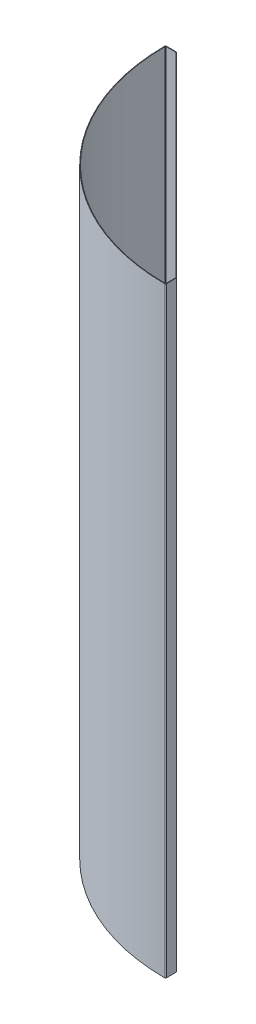
ISO-10303-21;
HEADER;
FILE_DESCRIPTION(('STEP AP214'),'2;1');
FILE_NAME('part.step','',(''),(''),'','','');
FILE_SCHEMA(('AUTOMOTIVE_DESIGN { 1 0 10303 214 1 1 1 1 }'));
ENDSEC;
DATA;
#1=APPLICATION_CONTEXT('core data for automotive mechanical design processes');
#2=APPLICATION_PROTOCOL_DEFINITION('international standard','automotive_design',2000,#1);
#3=PRODUCT_CONTEXT('',#1,'mechanical');
#4=PRODUCT('Part','Part','',(#3));
#5=PRODUCT_RELATED_PRODUCT_CATEGORY('part','',(#4));
#6=PRODUCT_DEFINITION_FORMATION('','',#4);
#7=PRODUCT_DEFINITION_CONTEXT('part definition',#1,'design');
#8=PRODUCT_DEFINITION('design','',#6,#7);
#9=PRODUCT_DEFINITION_SHAPE('','',#8);
#10=(LENGTH_UNIT() NAMED_UNIT(*) SI_UNIT(.MILLI.,.METRE.));
#11=(NAMED_UNIT(*) PLANE_ANGLE_UNIT() SI_UNIT($,.RADIAN.));
#12=(NAMED_UNIT(*) SI_UNIT($,.STERADIAN.) SOLID_ANGLE_UNIT());
#13=UNCERTAINTY_MEASURE_WITH_UNIT(LENGTH_MEASURE(1.E-05),#10,'distance_accuracy_value','');
#14=(GEOMETRIC_REPRESENTATION_CONTEXT(3) GLOBAL_UNCERTAINTY_ASSIGNED_CONTEXT((#13)) GLOBAL_UNIT_ASSIGNED_CONTEXT((#10,
#11,#12)) REPRESENTATION_CONTEXT('',''));
#15=CARTESIAN_POINT('',(0.,0.,0.));
#16=DIRECTION('',(0.,0.,1.));
#17=DIRECTION('',(1.,0.,0.));
#18=AXIS2_PLACEMENT_3D('',#15,#16,#17);
#19=CARTESIAN_POINT('',(-92.4999999999991,-731.,92.4999999999996));
#20=DIRECTION('',(0.,1.,0.));
#21=DIRECTION('',(-0.999997106121887,0.,-0.00240577385725729));
#22=AXIS2_PLACEMENT_3D('',#19,#20,#21);
#23=PLANE('',#22);
#24=DIRECTION('',(-0.00240577385725768,0.,0.999997106121887));
#25=VECTOR('',#24,1.);
#26=CARTESIAN_POINT('',(-93.7028869286286,-731.,592.498553060943));
#27=LINE('',#26,#25);
#28=CARTESIAN_POINT('',(-93.7028869286286,-731.,592.498553060943));
#29=VERTEX_POINT('',#28);
#30=CARTESIAN_POINT('',(-93.7057738572573,-731.,593.69854958829));
#31=VERTEX_POINT('',#30);
#32=EDGE_CURVE('E237',#29,#31,#27,.T.);
#33=ORIENTED_EDGE('',*,*,#32,.T.);
#34=CARTESIAN_POINT('',(-92.4999999999991,-731.,92.4999999999996));
#35=DIRECTION('',(0.,1.,0.));
#36=DIRECTION('',(-0.999997106121887,0.,-0.00240577385725729));
#37=AXIS2_PLACEMENT_3D('',#34,#35,#36);
#38=CIRCLE('',#37,501.200000000001);
#39=CARTESIAN_POINT('',(-593.69854958829,-731.,93.7057738572566));
#40=VERTEX_POINT('',#39);
#41=EDGE_CURVE('E56',#31,#40,#38,.F.);
#42=ORIENTED_EDGE('',*,*,#41,.T.);
#43=DIRECTION('',(0.999997106121887,0.,-0.00240577385724612));
#44=VECTOR('',#43,1.);
#45=CARTESIAN_POINT('',(-593.69854958829,-731.,93.7057738572583));
#46=LINE('',#45,#44);
#47=CARTESIAN_POINT('',(-592.498553060944,-731.,93.7028869286292));
#48=VERTEX_POINT('',#47);
#49=EDGE_CURVE('E242',#40,#48,#46,.T.);
#50=ORIENTED_EDGE('',*,*,#49,.T.);
#51=CARTESIAN_POINT('',(-92.4999999999991,-731.,92.4999999999996));
#52=DIRECTION('',(0.,-1.,0.));
#53=DIRECTION('',(0.999997106121887,0.,0.00240577385725729));
#54=AXIS2_PLACEMENT_3D('',#51,#52,#53);
#55=CIRCLE('',#54,500.000000000001);
#56=EDGE_CURVE('E221',#29,#48,#55,.T.);
#57=ORIENTED_EDGE('',*,*,#56,.F.);
#58=EDGE_LOOP('',(#33,#42,#50,#57));
#59=FACE_BOUND('',#58,.T.);
#60=ADVANCED_FACE('F36',(#59),#23,.F.);
#61=CARTESIAN_POINT('',(-92.4999999999991,731.,92.4999999999996));
#62=DIRECTION('',(0.,-1.,0.));
#63=DIRECTION('',(0.999997106121887,0.,0.00240577385725729));
#64=AXIS2_PLACEMENT_3D('',#61,#62,#63);
#65=PLANE('',#64);
#66=DIRECTION('',(-0.999997106121887,0.,0.00240577385724612));
#67=VECTOR('',#66,1.);
#68=CARTESIAN_POINT('',(-592.498553060944,731.,93.7028869286296));
#69=LINE('',#68,#67);
#70=CARTESIAN_POINT('',(-592.498553060944,731.,93.7028869286284));
#71=VERTEX_POINT('',#70);
#72=CARTESIAN_POINT('',(-593.69854958829,731.,93.7057738572583));
#73=VERTEX_POINT('',#72);
#74=EDGE_CURVE('E11',#71,#73,#69,.T.);
#75=ORIENTED_EDGE('',*,*,#74,.T.);
#76=CARTESIAN_POINT('',(-92.4999999999991,731.,92.4999999999996));
#77=DIRECTION('',(0.,1.,0.));
#78=DIRECTION('',(-0.999997106121887,0.,-0.00240577385725729));
#79=AXIS2_PLACEMENT_3D('',#76,#77,#78);
#80=CIRCLE('',#79,501.200000000001);
#81=CARTESIAN_POINT('',(-93.7057738572573,731.,593.69854958829));
#82=VERTEX_POINT('',#81);
#83=EDGE_CURVE('E225',#73,#82,#80,.T.);
#84=ORIENTED_EDGE('',*,*,#83,.T.);
#85=DIRECTION('',(0.00240577385725768,0.,-0.999997106121887));
#86=VECTOR('',#85,1.);
#87=CARTESIAN_POINT('',(-93.7057738572573,731.,593.69854958829));
#88=LINE('',#87,#86);
#89=CARTESIAN_POINT('',(-93.7028869286286,731.,592.498553060943));
#90=VERTEX_POINT('',#89);
#91=EDGE_CURVE('E233',#82,#90,#88,.T.);
#92=ORIENTED_EDGE('',*,*,#91,.T.);
#93=CARTESIAN_POINT('',(-92.4999999999991,731.,92.4999999999996));
#94=DIRECTION('',(0.,1.,0.));
#95=DIRECTION('',(-0.999997106121887,0.,-0.00240577385725729));
#96=AXIS2_PLACEMENT_3D('',#93,#94,#95);
#97=CIRCLE('',#96,500.000000000001);
#98=EDGE_CURVE('E224',#71,#90,#97,.T.);
#99=ORIENTED_EDGE('',*,*,#98,.F.);
#100=EDGE_LOOP('',(#75,#84,#92,#99));
#101=FACE_BOUND('',#100,.T.);
#102=ADVANCED_FACE('F294',(#101),#65,.F.);
#103=CARTESIAN_POINT('',(-92.4999999999991,-1658.71246490858,92.4999999999996));
#104=DIRECTION('',(0.,1.,0.));
#105=DIRECTION('',(-0.999997106121887,0.,-0.00240577385725729));
#106=AXIS2_PLACEMENT_3D('',#103,#104,#105);
#107=CYLINDRICAL_SURFACE('',#106,500.000000000001);
#108=ORIENTED_EDGE('',*,*,#98,.T.);
#109=DIRECTION('',(0.,1.,0.));
#110=VECTOR('',#109,1.);
#111=CARTESIAN_POINT('',(-93.7028869286286,-731.,592.498553060943));
#112=LINE('',#111,#110);
#113=EDGE_CURVE('E228',#29,#90,#112,.T.);
#114=ORIENTED_EDGE('',*,*,#113,.F.);
#115=ORIENTED_EDGE('',*,*,#56,.T.);
#116=DIRECTION('',(0.,1.,0.));
#117=VECTOR('',#116,1.);
#118=CARTESIAN_POINT('',(-592.498553060944,-731.,93.7028869286296));
#119=LINE('',#118,#117);
#120=EDGE_CURVE('E239',#48,#71,#119,.T.);
#121=ORIENTED_EDGE('',*,*,#120,.T.);
#122=EDGE_LOOP('',(#108,#114,#115,#121));
#123=FACE_BOUND('',#122,.T.);
#124=ADVANCED_FACE('F265',(#123),#107,.F.);
#125=CARTESIAN_POINT('',(-92.4999999999991,-1658.71246490858,92.4999999999996));
#126=DIRECTION('',(0.,1.,0.));
#127=DIRECTION('',(-0.999997106121887,0.,-0.00240577385725729));
#128=AXIS2_PLACEMENT_3D('',#125,#126,#127);
#129=CYLINDRICAL_SURFACE('',#128,501.200000000001);
#130=ORIENTED_EDGE('',*,*,#83,.F.);
#131=DIRECTION('',(0.,1.,0.));
#132=VECTOR('',#131,1.);
#133=CARTESIAN_POINT('',(-593.69854958829,-731.,93.7057738572583));
#134=LINE('',#133,#132);
#135=EDGE_CURVE('E43',#40,#73,#134,.T.);
#136=ORIENTED_EDGE('',*,*,#135,.F.);
#137=ORIENTED_EDGE('',*,*,#41,.F.);
#138=DIRECTION('',(0.,1.,0.));
#139=VECTOR('',#138,1.);
#140=CARTESIAN_POINT('',(-93.7057738572573,-731.,593.69854958829));
#141=LINE('',#140,#139);
#142=EDGE_CURVE('E235',#31,#82,#141,.T.);
#143=ORIENTED_EDGE('',*,*,#142,.T.);
#144=EDGE_LOOP('',(#130,#136,#137,#143));
#145=FACE_BOUND('',#144,.T.);
#146=ADVANCED_FACE('F289',(#145),#129,.T.);
#147=CARTESIAN_POINT('',(-92.4999999999999,-731.,567.5));
#148=DIRECTION('',(0.,0.,1.));
#149=DIRECTION('',(1.,0.,0.));
#150=AXIS2_PLACEMENT_3D('',#147,#148,#149);
#151=PLANE('',#150);
#152=DIRECTION('',(1.,0.,0.));
#153=VECTOR('',#152,1.);
#154=CARTESIAN_POINT('',(-92.4999999999999,731.,567.5));
#155=LINE('',#154,#153);
#156=CARTESIAN_POINT('',(-92.4999999999999,731.,567.5));
#157=VERTEX_POINT('',#156);
#158=CARTESIAN_POINT('',(-91.2999999999999,731.,567.5));
#159=VERTEX_POINT('',#158);
#160=EDGE_CURVE('E217',#157,#159,#155,.T.);
#161=ORIENTED_EDGE('',*,*,#160,.T.);
#162=DIRECTION('',(0.,1.,0.));
#163=VECTOR('',#162,1.);
#164=CARTESIAN_POINT('',(-91.2999999999999,-731.,567.5));
#165=LINE('',#164,#163);
#166=CARTESIAN_POINT('',(-91.2999999999999,-731.,567.5));
#167=VERTEX_POINT('',#166);
#168=EDGE_CURVE('E198',#167,#159,#165,.T.);
#169=ORIENTED_EDGE('',*,*,#168,.F.);
#170=DIRECTION('',(1.,0.,0.));
#171=VECTOR('',#170,1.);
#172=CARTESIAN_POINT('',(-92.4999999999999,-731.,567.5));
#173=LINE('',#172,#171);
#174=CARTESIAN_POINT('',(-92.4999999999999,-731.,567.5));
#175=VERTEX_POINT('',#174);
#176=EDGE_CURVE('E191',#175,#167,#173,.T.);
#177=ORIENTED_EDGE('',*,*,#176,.F.);
#178=DIRECTION('',(0.,1.,0.));
#179=VECTOR('',#178,1.);
#180=CARTESIAN_POINT('',(-92.4999999999999,-731.,567.5));
#181=LINE('',#180,#179);
#182=EDGE_CURVE('E214',#175,#157,#181,.T.);
#183=ORIENTED_EDGE('',*,*,#182,.T.);
#184=EDGE_LOOP('',(#161,#169,#177,#183));
#185=FACE_BOUND('',#184,.T.);
#186=ADVANCED_FACE('F303',(#185),#151,.F.);
#187=CARTESIAN_POINT('',(-92.4999999999999,-731.,592.5));
#188=DIRECTION('',(1.,0.,0.));
#189=DIRECTION('',(0.,0.,-1.));
#190=AXIS2_PLACEMENT_3D('',#187,#188,#189);
#191=PLANE('',#190);
#192=DIRECTION('',(0.,0.,-1.));
#193=VECTOR('',#192,1.);
#194=CARTESIAN_POINT('',(-92.4999999999999,731.,592.5));
#195=LINE('',#194,#193);
#196=CARTESIAN_POINT('',(-92.4999999999999,731.,591.298556533597));
#197=VERTEX_POINT('',#196);
#198=EDGE_CURVE('E212',#197,#157,#195,.T.);
#199=ORIENTED_EDGE('',*,*,#198,.T.);
#200=ORIENTED_EDGE('',*,*,#182,.F.);
#201=DIRECTION('',(0.,0.,-1.));
#202=VECTOR('',#201,1.);
#203=CARTESIAN_POINT('',(-92.4999999999999,-731.,592.5));
#204=LINE('',#203,#202);
#205=CARTESIAN_POINT('',(-92.4999999999999,-731.,591.298556533597));
#206=VERTEX_POINT('',#205);
#207=EDGE_CURVE('E193',#206,#175,#204,.T.);
#208=ORIENTED_EDGE('',*,*,#207,.F.);
#209=DIRECTION('',(0.,1.,0.));
#210=VECTOR('',#209,1.);
#211=CARTESIAN_POINT('',(-92.4999999999999,-731.,591.298556533597));
#212=LINE('',#211,#210);
#213=EDGE_CURVE('E209',#206,#197,#212,.T.);
#214=ORIENTED_EDGE('',*,*,#213,.T.);
#215=EDGE_LOOP('',(#199,#200,#208,#214));
#216=FACE_BOUND('',#215,.T.);
#217=ADVANCED_FACE('F279',(#216),#191,.F.);
#218=CARTESIAN_POINT('',(-93.7057738572574,731.,593.69854958829));
#219=DIRECTION('',(0.,1.,0.));
#220=DIRECTION('',(0.,0.,1.));
#221=AXIS2_PLACEMENT_3D('',#218,#219,#220);
#222=PLANE('',#221);
#223=ORIENTED_EDGE('',*,*,#198,.F.);
#224=DIRECTION('',(1.,0.,0.));
#225=VECTOR('',#224,1.);
#226=CARTESIAN_POINT('',(-92.4999999999999,731.,591.298556533597));
#227=LINE('',#226,#225);
#228=CARTESIAN_POINT('',(-91.2999999999999,731.,591.298556533597));
#229=VERTEX_POINT('',#228);
#230=EDGE_CURVE('E206',#197,#229,#227,.T.);
#231=ORIENTED_EDGE('',*,*,#230,.T.);
#232=DIRECTION('',(0.,0.,-1.));
#233=VECTOR('',#232,1.);
#234=CARTESIAN_POINT('',(-91.2999999999999,731.,592.5));
#235=LINE('',#234,#233);
#236=EDGE_CURVE('E203',#229,#159,#235,.T.);
#237=ORIENTED_EDGE('',*,*,#236,.T.);
#238=ORIENTED_EDGE('',*,*,#160,.F.);
#239=EDGE_LOOP('',(#223,#231,#237,#238));
#240=FACE_BOUND('',#239,.T.);
#241=ADVANCED_FACE('F310',(#240),#222,.T.);
#242=CARTESIAN_POINT('',(-91.2999999999999,-731.,592.5));
#243=DIRECTION('',(1.,0.,0.));
#244=DIRECTION('',(0.,0.,-1.));
#245=AXIS2_PLACEMENT_3D('',#242,#243,#244);
#246=PLANE('',#245);
#247=ORIENTED_EDGE('',*,*,#236,.F.);
#248=DIRECTION('',(0.,1.,0.));
#249=VECTOR('',#248,1.);
#250=CARTESIAN_POINT('',(-91.2999999999999,-731.,591.298556533597));
#251=LINE('',#250,#249);
#252=CARTESIAN_POINT('',(-91.2999999999999,-731.,591.298556533597));
#253=VERTEX_POINT('',#252);
#254=EDGE_CURVE('E186',#253,#229,#251,.T.);
#255=ORIENTED_EDGE('',*,*,#254,.F.);
#256=DIRECTION('',(0.,0.,-1.));
#257=VECTOR('',#256,1.);
#258=CARTESIAN_POINT('',(-91.2999999999999,-731.,592.5));
#259=LINE('',#258,#257);
#260=EDGE_CURVE('E200',#253,#167,#259,.T.);
#261=ORIENTED_EDGE('',*,*,#260,.T.);
#262=ORIENTED_EDGE('',*,*,#168,.T.);
#263=EDGE_LOOP('',(#247,#255,#261,#262));
#264=FACE_BOUND('',#263,.T.);
#265=ADVANCED_FACE('F307',(#264),#246,.T.);
#266=CARTESIAN_POINT('',(-93.6999999999999,-731.,591.298556533597));
#267=DIRECTION('',(0.,1.,0.));
#268=DIRECTION('',(1.,0.,0.));
#269=AXIS2_PLACEMENT_3D('',#266,#267,#268);
#270=PLANE('',#269);
#271=ORIENTED_EDGE('',*,*,#260,.F.);
#272=DIRECTION('',(-1.,0.,0.));
#273=VECTOR('',#272,1.);
#274=CARTESIAN_POINT('',(-91.2999999999999,-731.,591.298556533597));
#275=LINE('',#274,#273);
#276=EDGE_CURVE('E195',#253,#206,#275,.T.);
#277=ORIENTED_EDGE('',*,*,#276,.T.);
#278=ORIENTED_EDGE('',*,*,#207,.T.);
#279=ORIENTED_EDGE('',*,*,#176,.T.);
#280=EDGE_LOOP('',(#271,#277,#278,#279));
#281=FACE_BOUND('',#280,.T.);
#282=ADVANCED_FACE('F283',(#281),#270,.F.);
#283=CARTESIAN_POINT('',(-93.6999999999999,-731.,591.298556533597));
#284=DIRECTION('',(0.,1.,0.));
#285=DIRECTION('',(0.,0.,1.));
#286=AXIS2_PLACEMENT_3D('',#283,#284,#285);
#287=PLANE('',#286);
#288=ORIENTED_EDGE('',*,*,#276,.F.);
#289=CARTESIAN_POINT('',(-93.6999999999999,-731.,591.298556533597));
#290=DIRECTION('',(0.,1.,0.));
#291=DIRECTION('',(0.,0.,1.));
#292=AXIS2_PLACEMENT_3D('',#289,#290,#291);
#293=CIRCLE('',#292,2.4);
#294=EDGE_CURVE('E173',#253,#31,#293,.F.);
#295=ORIENTED_EDGE('',*,*,#294,.T.);
#296=ORIENTED_EDGE('',*,*,#32,.F.);
#297=CARTESIAN_POINT('',(-93.6999999999999,-731.,591.298556533597));
#298=DIRECTION('',(0.,-1.,0.));
#299=DIRECTION('',(0.,0.,-1.));
#300=AXIS2_PLACEMENT_3D('',#297,#298,#299);
#301=CIRCLE('',#300,1.2);
#302=EDGE_CURVE('E179',#206,#29,#301,.T.);
#303=ORIENTED_EDGE('',*,*,#302,.F.);
#304=EDGE_LOOP('',(#288,#295,#296,#303));
#305=FACE_BOUND('',#304,.T.);
#306=ADVANCED_FACE('F270',(#305),#287,.F.);
#307=CARTESIAN_POINT('',(-93.6999999999999,731.,591.298556533597));
#308=DIRECTION('',(0.,-1.,0.));
#309=DIRECTION('',(0.,0.,-1.));
#310=AXIS2_PLACEMENT_3D('',#307,#308,#309);
#311=PLANE('',#310);
#312=ORIENTED_EDGE('',*,*,#91,.F.);
#313=CARTESIAN_POINT('',(-93.6999999999999,731.,591.298556533597));
#314=DIRECTION('',(0.,1.,0.));
#315=DIRECTION('',(0.,0.,1.));
#316=AXIS2_PLACEMENT_3D('',#313,#314,#315);
#317=CIRCLE('',#316,2.4);
#318=EDGE_CURVE('E183',#82,#229,#317,.T.);
#319=ORIENTED_EDGE('',*,*,#318,.T.);
#320=ORIENTED_EDGE('',*,*,#230,.F.);
#321=CARTESIAN_POINT('',(-93.6999999999999,731.,591.298556533597));
#322=DIRECTION('',(0.,1.,0.));
#323=DIRECTION('',(0.,0.,1.));
#324=AXIS2_PLACEMENT_3D('',#321,#322,#323);
#325=CIRCLE('',#324,1.2);
#326=EDGE_CURVE('E182',#90,#197,#325,.T.);
#327=ORIENTED_EDGE('',*,*,#326,.F.);
#328=EDGE_LOOP('',(#312,#319,#320,#327));
#329=FACE_BOUND('',#328,.T.);
#330=ADVANCED_FACE('F291',(#329),#311,.F.);
#331=CARTESIAN_POINT('',(-93.6999999999999,-1462.00246860455,591.298556533597));
#332=DIRECTION('',(0.,1.,0.));
#333=DIRECTION('',(0.,0.,1.));
#334=AXIS2_PLACEMENT_3D('',#331,#332,#333);
#335=CYLINDRICAL_SURFACE('',#334,1.2);
#336=ORIENTED_EDGE('',*,*,#326,.T.);
#337=ORIENTED_EDGE('',*,*,#213,.F.);
#338=ORIENTED_EDGE('',*,*,#302,.T.);
#339=ORIENTED_EDGE('',*,*,#113,.T.);
#340=EDGE_LOOP('',(#336,#337,#338,#339));
#341=FACE_BOUND('',#340,.T.);
#342=ADVANCED_FACE('F274',(#341),#335,.F.);
#343=CARTESIAN_POINT('',(-93.6999999999999,-1462.00246860455,591.298556533597));
#344=DIRECTION('',(0.,1.,0.));
#345=DIRECTION('',(0.,0.,1.));
#346=AXIS2_PLACEMENT_3D('',#343,#344,#345);
#347=CYLINDRICAL_SURFACE('',#346,2.4);
#348=ORIENTED_EDGE('',*,*,#318,.F.);
#349=ORIENTED_EDGE('',*,*,#142,.F.);
#350=ORIENTED_EDGE('',*,*,#294,.F.);
#351=ORIENTED_EDGE('',*,*,#254,.T.);
#352=EDGE_LOOP('',(#348,#349,#350,#351));
#353=FACE_BOUND('',#352,.T.);
#354=ADVANCED_FACE('F287',(#353),#347,.T.);
#355=CARTESIAN_POINT('',(-591.298556533597,-731.,93.7000000000009));
#356=DIRECTION('',(0.,1.,0.));
#357=DIRECTION('',(0.,0.,1.));
#358=AXIS2_PLACEMENT_3D('',#355,#356,#357);
#359=PLANE('',#358);
#360=ORIENTED_EDGE('',*,*,#49,.F.);
#361=CARTESIAN_POINT('',(-591.298556533597,-731.,93.7000000000009));
#362=DIRECTION('',(0.,1.,0.));
#363=DIRECTION('',(0.,0.,1.));
#364=AXIS2_PLACEMENT_3D('',#361,#362,#363);
#365=CIRCLE('',#364,2.4);
#366=CARTESIAN_POINT('',(-591.298556533597,-731.,91.3000000000008));
#367=VERTEX_POINT('',#366);
#368=EDGE_CURVE('E175',#40,#367,#365,.F.);
#369=ORIENTED_EDGE('',*,*,#368,.T.);
#370=DIRECTION('',(0.,0.,-1.));
#371=VECTOR('',#370,1.);
#372=CARTESIAN_POINT('',(-591.298556533597,-731.,92.5000000000007));
#373=LINE('',#372,#371);
#374=CARTESIAN_POINT('',(-591.298556533598,-731.,92.5000000000007));
#375=VERTEX_POINT('',#374);
#376=EDGE_CURVE('E146',#375,#367,#373,.T.);
#377=ORIENTED_EDGE('',*,*,#376,.F.);
#378=CARTESIAN_POINT('',(-591.298556533597,-731.,93.7000000000009));
#379=DIRECTION('',(0.,-1.,0.));
#380=DIRECTION('',(0.,0.,-1.));
#381=AXIS2_PLACEMENT_3D('',#378,#379,#380);
#382=CIRCLE('',#381,1.2);
#383=EDGE_CURVE('E166',#48,#375,#382,.T.);
#384=ORIENTED_EDGE('',*,*,#383,.F.);
#385=EDGE_LOOP('',(#360,#369,#377,#384));
#386=FACE_BOUND('',#385,.T.);
#387=ADVANCED_FACE('F247',(#386),#359,.F.);
#388=CARTESIAN_POINT('',(-591.298556533597,731.,93.7000000000009));
#389=DIRECTION('',(0.,-1.,0.));
#390=DIRECTION('',(0.,0.,-1.));
#391=AXIS2_PLACEMENT_3D('',#388,#389,#390);
#392=PLANE('',#391);
#393=DIRECTION('',(0.,0.,1.));
#394=VECTOR('',#393,1.);
#395=CARTESIAN_POINT('',(-591.298556533597,731.,91.3000000000008));
#396=LINE('',#395,#394);
#397=CARTESIAN_POINT('',(-591.298556533597,731.,91.3000000000008));
#398=VERTEX_POINT('',#397);
#399=CARTESIAN_POINT('',(-591.298556533598,731.,92.5000000000009));
#400=VERTEX_POINT('',#399);
#401=EDGE_CURVE('E178',#398,#400,#396,.T.);
#402=ORIENTED_EDGE('',*,*,#401,.F.);
#403=CARTESIAN_POINT('',(-591.298556533597,731.,93.7000000000009));
#404=DIRECTION('',(0.,1.,0.));
#405=DIRECTION('',(0.,0.,1.));
#406=AXIS2_PLACEMENT_3D('',#403,#404,#405);
#407=CIRCLE('',#406,2.4);
#408=EDGE_CURVE('E170',#398,#73,#407,.T.);
#409=ORIENTED_EDGE('',*,*,#408,.T.);
#410=ORIENTED_EDGE('',*,*,#74,.F.);
#411=CARTESIAN_POINT('',(-591.298556533597,731.,93.7000000000009));
#412=DIRECTION('',(0.,1.,0.));
#413=DIRECTION('',(0.,0.,1.));
#414=AXIS2_PLACEMENT_3D('',#411,#412,#413);
#415=CIRCLE('',#414,1.2);
#416=EDGE_CURVE('E169',#400,#71,#415,.T.);
#417=ORIENTED_EDGE('',*,*,#416,.F.);
#418=EDGE_LOOP('',(#402,#409,#410,#417));
#419=FACE_BOUND('',#418,.T.);
#420=ADVANCED_FACE('F253',(#419),#392,.F.);
#421=CARTESIAN_POINT('',(-591.298556533597,-1462.00247809777,93.7000000000009));
#422=DIRECTION('',(0.,1.,0.));
#423=DIRECTION('',(0.,0.,1.));
#424=AXIS2_PLACEMENT_3D('',#421,#422,#423);
#425=CYLINDRICAL_SURFACE('',#424,1.2);
#426=ORIENTED_EDGE('',*,*,#416,.T.);
#427=ORIENTED_EDGE('',*,*,#120,.F.);
#428=ORIENTED_EDGE('',*,*,#383,.T.);
#429=DIRECTION('',(0.,1.,0.));
#430=VECTOR('',#429,1.);
#431=CARTESIAN_POINT('',(-591.298556533597,-731.,92.5000000000007));
#432=LINE('',#431,#430);
#433=EDGE_CURVE('E163',#375,#400,#432,.T.);
#434=ORIENTED_EDGE('',*,*,#433,.T.);
#435=EDGE_LOOP('',(#426,#427,#428,#434));
#436=FACE_BOUND('',#435,.T.);
#437=ADVANCED_FACE('F262',(#436),#425,.F.);
#438=CARTESIAN_POINT('',(-591.298556533597,-1462.00247809777,93.7000000000009));
#439=DIRECTION('',(0.,1.,0.));
#440=DIRECTION('',(0.,0.,1.));
#441=AXIS2_PLACEMENT_3D('',#438,#439,#440);
#442=CYLINDRICAL_SURFACE('',#441,2.4);
#443=ORIENTED_EDGE('',*,*,#408,.F.);
#444=DIRECTION('',(0.,1.,0.));
#445=VECTOR('',#444,1.);
#446=CARTESIAN_POINT('',(-591.298556533597,-731.,91.3000000000008));
#447=LINE('',#446,#445);
#448=EDGE_CURVE('E151',#367,#398,#447,.T.);
#449=ORIENTED_EDGE('',*,*,#448,.F.);
#450=ORIENTED_EDGE('',*,*,#368,.F.);
#451=ORIENTED_EDGE('',*,*,#135,.T.);
#452=EDGE_LOOP('',(#443,#449,#450,#451));
#453=FACE_BOUND('',#452,.T.);
#454=ADVANCED_FACE('F249',(#453),#442,.T.);
#455=CARTESIAN_POINT('',(-567.5,-731.,91.3000000000007));
#456=DIRECTION('',(-1.,0.,0.));
#457=DIRECTION('',(0.,0.,1.));
#458=AXIS2_PLACEMENT_3D('',#455,#456,#457);
#459=PLANE('',#458);
#460=DIRECTION('',(0.,0.,1.));
#461=VECTOR('',#460,1.);
#462=CARTESIAN_POINT('',(-567.5,731.,91.3000000000007));
#463=LINE('',#462,#461);
#464=CARTESIAN_POINT('',(-567.5,731.,91.3000000000007));
#465=VERTEX_POINT('',#464);
#466=CARTESIAN_POINT('',(-567.5,731.,92.5000000000008));
#467=VERTEX_POINT('',#466);
#468=EDGE_CURVE('E136',#465,#467,#463,.T.);
#469=ORIENTED_EDGE('',*,*,#468,.T.);
#470=DIRECTION('',(0.,1.,0.));
#471=VECTOR('',#470,1.);
#472=CARTESIAN_POINT('',(-567.5,-731.,92.5000000000008));
#473=LINE('',#472,#471);
#474=CARTESIAN_POINT('',(-567.5,-731.,92.5000000000008));
#475=VERTEX_POINT('',#474);
#476=EDGE_CURVE('E142',#475,#467,#473,.T.);
#477=ORIENTED_EDGE('',*,*,#476,.F.);
#478=DIRECTION('',(0.,0.,1.));
#479=VECTOR('',#478,1.);
#480=CARTESIAN_POINT('',(-567.5,-731.,91.3000000000007));
#481=LINE('',#480,#479);
#482=CARTESIAN_POINT('',(-567.5,-731.,91.3000000000007));
#483=VERTEX_POINT('',#482);
#484=EDGE_CURVE('E139',#483,#475,#481,.T.);
#485=ORIENTED_EDGE('',*,*,#484,.F.);
#486=DIRECTION('',(0.,1.,0.));
#487=VECTOR('',#486,1.);
#488=CARTESIAN_POINT('',(-567.5,-731.,91.3000000000007));
#489=LINE('',#488,#487);
#490=EDGE_CURVE('E125',#483,#465,#489,.T.);
#491=ORIENTED_EDGE('',*,*,#490,.T.);
#492=EDGE_LOOP('',(#469,#477,#485,#491));
#493=FACE_BOUND('',#492,.T.);
#494=ADVANCED_FACE('F140',(#493),#459,.F.);
#495=CARTESIAN_POINT('',(-592.5,-731.,92.5000000000006));
#496=DIRECTION('',(0.,0.,-1.));
#497=DIRECTION('',(-1.,0.,0.));
#498=AXIS2_PLACEMENT_3D('',#495,#496,#497);
#499=PLANE('',#498);
#500=DIRECTION('',(-1.,0.,0.));
#501=VECTOR('',#500,1.);
#502=CARTESIAN_POINT('',(-592.5,731.,92.5000000000006));
#503=LINE('',#502,#501);
#504=EDGE_CURVE('E135',#467,#400,#503,.T.);
#505=ORIENTED_EDGE('',*,*,#504,.T.);
#506=ORIENTED_EDGE('',*,*,#433,.F.);
#507=DIRECTION('',(-1.,0.,0.));
#508=VECTOR('',#507,1.);
#509=CARTESIAN_POINT('',(-592.5,-731.,92.5000000000006));
#510=LINE('',#509,#508);
#511=EDGE_CURVE('E157',#475,#375,#510,.T.);
#512=ORIENTED_EDGE('',*,*,#511,.F.);
#513=ORIENTED_EDGE('',*,*,#476,.T.);
#514=EDGE_LOOP('',(#505,#506,#512,#513));
#515=FACE_BOUND('',#514,.T.);
#516=ADVANCED_FACE('F260',(#515),#499,.F.);
#517=CARTESIAN_POINT('',(-593.69854958829,-731.,93.7057738572578));
#518=DIRECTION('',(0.,-1.,0.));
#519=DIRECTION('',(0.,0.,-1.));
#520=AXIS2_PLACEMENT_3D('',#517,#518,#519);
#521=PLANE('',#520);
#522=ORIENTED_EDGE('',*,*,#511,.T.);
#523=ORIENTED_EDGE('',*,*,#376,.T.);
#524=DIRECTION('',(1.,0.,0.));
#525=VECTOR('',#524,1.);
#526=CARTESIAN_POINT('',(-592.5,-731.,91.3000000000007));
#527=LINE('',#526,#525);
#528=EDGE_CURVE('E130',#483,#367,#527,.F.);
#529=ORIENTED_EDGE('',*,*,#528,.F.);
#530=ORIENTED_EDGE('',*,*,#484,.T.);
#531=EDGE_LOOP('',(#522,#523,#529,#530));
#532=FACE_BOUND('',#531,.T.);
#533=ADVANCED_FACE('F148',(#532),#521,.T.);
#534=CARTESIAN_POINT('',(-592.5,-731.,91.3000000000007));
#535=DIRECTION('',(0.,0.,-1.));
#536=DIRECTION('',(-1.,0.,0.));
#537=AXIS2_PLACEMENT_3D('',#534,#535,#536);
#538=PLANE('',#537);
#539=DIRECTION('',(1.,0.,0.));
#540=VECTOR('',#539,1.);
#541=CARTESIAN_POINT('',(-592.5,731.,91.3000000000007));
#542=LINE('',#541,#540);
#543=EDGE_CURVE('E132',#465,#398,#542,.F.);
#544=ORIENTED_EDGE('',*,*,#543,.F.);
#545=ORIENTED_EDGE('',*,*,#490,.F.);
#546=ORIENTED_EDGE('',*,*,#528,.T.);
#547=ORIENTED_EDGE('',*,*,#448,.T.);
#548=EDGE_LOOP('',(#544,#545,#546,#547));
#549=FACE_BOUND('',#548,.T.);
#550=ADVANCED_FACE('F127',(#549),#538,.T.);
#551=CARTESIAN_POINT('',(-93.6999999999997,731.,591.298556533598));
#552=DIRECTION('',(0.,1.,0.));
#553=DIRECTION('',(1.,0.,0.));
#554=AXIS2_PLACEMENT_3D('',#551,#552,#553);
#555=PLANE('',#554);
#556=ORIENTED_EDGE('',*,*,#543,.T.);
#557=ORIENTED_EDGE('',*,*,#401,.T.);
#558=ORIENTED_EDGE('',*,*,#504,.F.);
#559=ORIENTED_EDGE('',*,*,#468,.F.);
#560=EDGE_LOOP('',(#556,#557,#558,#559));
#561=FACE_BOUND('',#560,.T.);
#562=ADVANCED_FACE('F258',(#561),#555,.T.);
#563=CLOSED_SHELL('',(#60,#102,#124,#146,#186,#217,#241,#265,#282,#306,#330,#342,#354,#387,#420,
#437,#454,#494,#516,#533,#550,#562));
#564=MANIFOLD_SOLID_BREP('B2',#563);
#565=ADVANCED_BREP_SHAPE_REPRESENTATION('',(#18,#564),#14);
#566=SHAPE_DEFINITION_REPRESENTATION(#9,#565);
ENDSEC;
END-ISO-10303-21;
